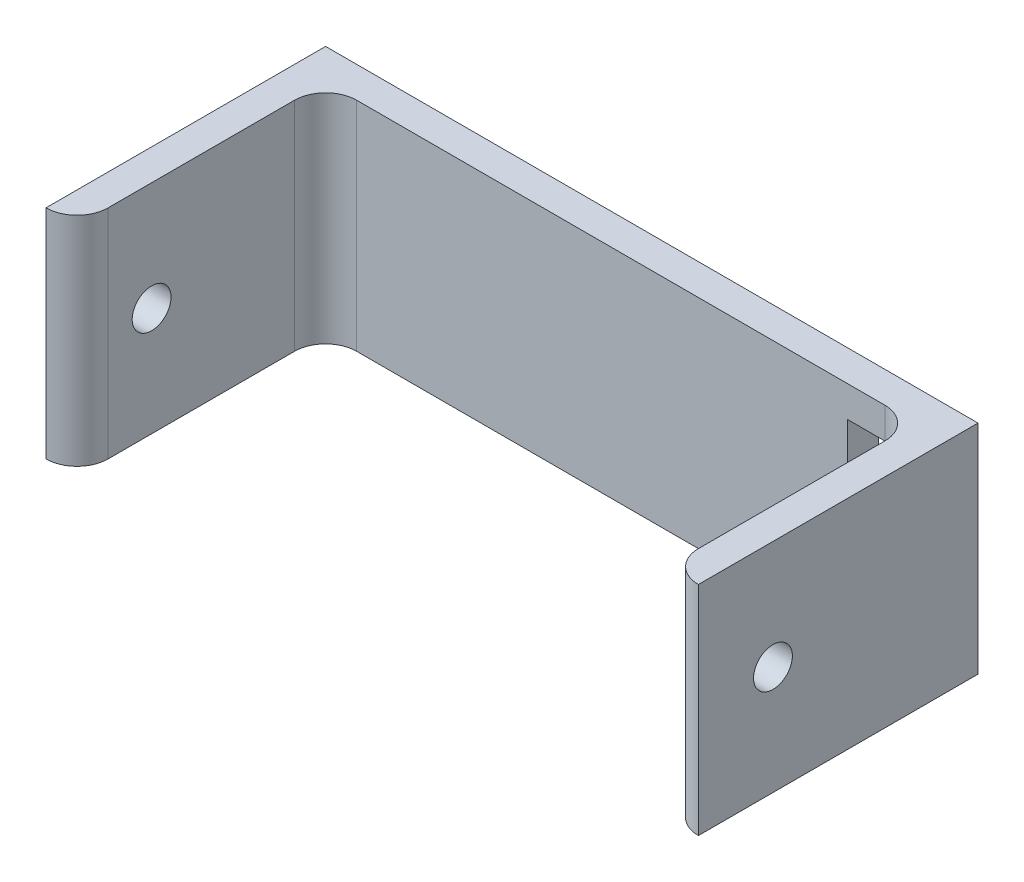
ISO-10303-21;
HEADER;
FILE_DESCRIPTION(('STEP AP214'),'2;1');
FILE_NAME('part.step','',(''),(''),'','','');
FILE_SCHEMA(('AUTOMOTIVE_DESIGN { 1 0 10303 214 1 1 1 1 }'));
ENDSEC;
DATA;
#1=APPLICATION_CONTEXT('core data for automotive mechanical design processes');
#2=APPLICATION_PROTOCOL_DEFINITION('international standard','automotive_design',2000,#1);
#3=PRODUCT_CONTEXT('',#1,'mechanical');
#4=PRODUCT('Part','Part','',(#3));
#5=PRODUCT_RELATED_PRODUCT_CATEGORY('part','',(#4));
#6=PRODUCT_DEFINITION_FORMATION('','',#4);
#7=PRODUCT_DEFINITION_CONTEXT('part definition',#1,'design');
#8=PRODUCT_DEFINITION('design','',#6,#7);
#9=PRODUCT_DEFINITION_SHAPE('','',#8);
#10=(LENGTH_UNIT() NAMED_UNIT(*) SI_UNIT(.MILLI.,.METRE.));
#11=(NAMED_UNIT(*) PLANE_ANGLE_UNIT() SI_UNIT($,.RADIAN.));
#12=(NAMED_UNIT(*) SI_UNIT($,.STERADIAN.) SOLID_ANGLE_UNIT());
#13=UNCERTAINTY_MEASURE_WITH_UNIT(LENGTH_MEASURE(1.E-05),#10,'distance_accuracy_value','');
#14=(GEOMETRIC_REPRESENTATION_CONTEXT(3) GLOBAL_UNCERTAINTY_ASSIGNED_CONTEXT((#13)) GLOBAL_UNIT_ASSIGNED_CONTEXT((#10,
#11,#12)) REPRESENTATION_CONTEXT('',''));
#15=CARTESIAN_POINT('',(0.,0.,0.));
#16=DIRECTION('',(0.,0.,1.));
#17=DIRECTION('',(1.,0.,0.));
#18=AXIS2_PLACEMENT_3D('',#15,#16,#17);
#19=CARTESIAN_POINT('',(6.34999999999999,44.45,-50.8));
#20=DIRECTION('',(1.,0.,0.));
#21=DIRECTION('',(0.,0.,-1.));
#22=AXIS2_PLACEMENT_3D('',#19,#20,#21);
#23=PLANE('',#22);
#24=CARTESIAN_POINT('',(6.34999999999999,22.225,-15.24));
#25=DIRECTION('',(1.,0.,0.));
#26=DIRECTION('',(0.,0.,-1.));
#27=AXIS2_PLACEMENT_3D('',#24,#25,#26);
#28=CIRCLE('',#27,3.96874999999998);
#29=CARTESIAN_POINT('',(6.34999999999999,22.225,-19.20875));
#30=VERTEX_POINT('',#29);
#31=EDGE_CURVE('E184',#30,#30,#28,.T.);
#32=ORIENTED_EDGE('',*,*,#31,.F.);
#33=EDGE_LOOP('',(#32));
#34=FACE_BOUND('',#33,.T.);
#35=DIRECTION('',(0.,0.,1.));
#36=VECTOR('',#35,1.);
#37=CARTESIAN_POINT('',(6.34999999999999,44.45,-50.8));
#38=LINE('',#37,#36);
#39=CARTESIAN_POINT('',(6.34999999999999,44.45,-44.45));
#40=VERTEX_POINT('',#39);
#41=CARTESIAN_POINT('',(6.35,44.45,-6.35));
#42=VERTEX_POINT('',#41);
#43=EDGE_CURVE('E188',#40,#42,#38,.T.);
#44=ORIENTED_EDGE('',*,*,#43,.T.);
#45=DIRECTION('',(0.,-1.,0.));
#46=VECTOR('',#45,1.);
#47=CARTESIAN_POINT('',(6.35,44.45,-6.35));
#48=LINE('',#47,#46);
#49=CARTESIAN_POINT('',(6.35,0.,-6.35));
#50=VERTEX_POINT('',#49);
#51=EDGE_CURVE('E262',#42,#50,#48,.T.);
#52=ORIENTED_EDGE('',*,*,#51,.T.);
#53=DIRECTION('',(0.,0.,1.));
#54=VECTOR('',#53,1.);
#55=CARTESIAN_POINT('',(6.34999999999999,0.,-50.8));
#56=LINE('',#55,#54);
#57=CARTESIAN_POINT('',(6.34999999999999,0.,-44.45));
#58=VERTEX_POINT('',#57);
#59=EDGE_CURVE('E187',#58,#50,#56,.T.);
#60=ORIENTED_EDGE('',*,*,#59,.F.);
#61=DIRECTION('',(0.,-1.,0.));
#62=VECTOR('',#61,1.);
#63=CARTESIAN_POINT('',(6.34999999999999,44.45,-44.45));
#64=LINE('',#63,#62);
#65=EDGE_CURVE('E241',#58,#40,#64,.F.);
#66=ORIENTED_EDGE('',*,*,#65,.T.);
#67=EDGE_LOOP('',(#44,#52,#60,#66));
#68=FACE_BOUND('',#67,.T.);
#69=ADVANCED_FACE('F35',(#34,#68),#23,.T.);
#70=CARTESIAN_POINT('',(127.,44.45,-50.8));
#71=DIRECTION('',(0.,0.,1.));
#72=DIRECTION('',(1.,0.,0.));
#73=AXIS2_PLACEMENT_3D('',#70,#71,#72);
#74=PLANE('',#73);
#75=DIRECTION('',(-1.,0.,0.));
#76=VECTOR('',#75,1.);
#77=CARTESIAN_POINT('',(127.,38.1,-50.8));
#78=LINE('',#77,#76);
#79=CARTESIAN_POINT('',(120.65,38.1,-50.8));
#80=VERTEX_POINT('',#79);
#81=CARTESIAN_POINT('',(113.03,38.1,-50.8));
#82=VERTEX_POINT('',#81);
#83=EDGE_CURVE('E174',#80,#82,#78,.T.);
#84=ORIENTED_EDGE('',*,*,#83,.F.);
#85=DIRECTION('',(0.,-1.,0.));
#86=VECTOR('',#85,1.);
#87=CARTESIAN_POINT('',(120.65,44.45,-50.8));
#88=LINE('',#87,#86);
#89=CARTESIAN_POINT('',(120.65,44.45,-50.8));
#90=VERTEX_POINT('',#89);
#91=EDGE_CURVE('E237',#80,#90,#88,.F.);
#92=ORIENTED_EDGE('',*,*,#91,.T.);
#93=DIRECTION('',(-1.,0.,0.));
#94=VECTOR('',#93,1.);
#95=CARTESIAN_POINT('',(127.,44.45,-50.8));
#96=LINE('',#95,#94);
#97=CARTESIAN_POINT('',(12.7,44.45,-50.8));
#98=VERTEX_POINT('',#97);
#99=EDGE_CURVE('E203',#90,#98,#96,.T.);
#100=ORIENTED_EDGE('',*,*,#99,.T.);
#101=DIRECTION('',(0.,-1.,0.));
#102=VECTOR('',#101,1.);
#103=CARTESIAN_POINT('',(12.7,0.,-50.8));
#104=LINE('',#103,#102);
#105=CARTESIAN_POINT('',(12.7,0.,-50.8));
#106=VERTEX_POINT('',#105);
#107=EDGE_CURVE('E234',#98,#106,#104,.T.);
#108=ORIENTED_EDGE('',*,*,#107,.T.);
#109=DIRECTION('',(-1.,0.,0.));
#110=VECTOR('',#109,1.);
#111=CARTESIAN_POINT('',(127.,0.,-50.8));
#112=LINE('',#111,#110);
#113=CARTESIAN_POINT('',(120.65,0.,-50.8));
#114=VERTEX_POINT('',#113);
#115=EDGE_CURVE('E192',#114,#106,#112,.T.);
#116=ORIENTED_EDGE('',*,*,#115,.F.);
#117=CARTESIAN_POINT('',(120.65,6.34999999999999,-50.8));
#118=VERTEX_POINT('',#117);
#119=EDGE_CURVE('E238',#114,#118,#88,.F.);
#120=ORIENTED_EDGE('',*,*,#119,.T.);
#121=DIRECTION('',(1.,0.,0.));
#122=VECTOR('',#121,1.);
#123=CARTESIAN_POINT('',(127.,6.34999999999999,-50.8));
#124=LINE('',#123,#122);
#125=CARTESIAN_POINT('',(113.03,6.34999999999999,-50.8));
#126=VERTEX_POINT('',#125);
#127=EDGE_CURVE('E58',#126,#118,#124,.T.);
#128=ORIENTED_EDGE('',*,*,#127,.F.);
#129=DIRECTION('',(0.,-1.,0.));
#130=VECTOR('',#129,1.);
#131=CARTESIAN_POINT('',(113.03,44.45,-50.8));
#132=LINE('',#131,#130);
#133=EDGE_CURVE('E151',#82,#126,#132,.T.);
#134=ORIENTED_EDGE('',*,*,#133,.F.);
#135=EDGE_LOOP('',(#84,#92,#100,#108,#116,#120,#128,#134));
#136=FACE_BOUND('',#135,.T.);
#137=ADVANCED_FACE('F278',(#136),#74,.T.);
#138=CARTESIAN_POINT('',(127.,44.45,0.));
#139=DIRECTION('',(-1.,0.,0.));
#140=DIRECTION('',(0.,0.,1.));
#141=AXIS2_PLACEMENT_3D('',#138,#139,#140);
#142=PLANE('',#141);
#143=CARTESIAN_POINT('',(127.,22.225,-15.24));
#144=DIRECTION('',(-1.,0.,0.));
#145=DIRECTION('',(0.,0.,1.));
#146=AXIS2_PLACEMENT_3D('',#143,#144,#145);
#147=CIRCLE('',#146,3.96874999999998);
#148=CARTESIAN_POINT('',(127.,22.225,-11.27125));
#149=VERTEX_POINT('',#148);
#150=EDGE_CURVE('E181',#149,#149,#147,.T.);
#151=ORIENTED_EDGE('',*,*,#150,.F.);
#152=EDGE_LOOP('',(#151));
#153=FACE_BOUND('',#152,.T.);
#154=DIRECTION('',(0.,0.,-1.));
#155=VECTOR('',#154,1.);
#156=CARTESIAN_POINT('',(127.,0.,0.));
#157=LINE('',#156,#155);
#158=CARTESIAN_POINT('',(127.,0.,-6.35));
#159=VERTEX_POINT('',#158);
#160=CARTESIAN_POINT('',(127.,0.,-44.45));
#161=VERTEX_POINT('',#160);
#162=EDGE_CURVE('E218',#159,#161,#157,.T.);
#163=ORIENTED_EDGE('',*,*,#162,.F.);
#164=DIRECTION('',(0.,-1.,0.));
#165=VECTOR('',#164,1.);
#166=CARTESIAN_POINT('',(127.,44.45,-6.35));
#167=LINE('',#166,#165);
#168=CARTESIAN_POINT('',(127.,44.45,-6.35));
#169=VERTEX_POINT('',#168);
#170=EDGE_CURVE('E256',#159,#169,#167,.F.);
#171=ORIENTED_EDGE('',*,*,#170,.T.);
#172=DIRECTION('',(0.,0.,-1.));
#173=VECTOR('',#172,1.);
#174=CARTESIAN_POINT('',(127.,44.45,0.));
#175=LINE('',#174,#173);
#176=CARTESIAN_POINT('',(127.,44.45,-44.45));
#177=VERTEX_POINT('',#176);
#178=EDGE_CURVE('E201',#169,#177,#175,.T.);
#179=ORIENTED_EDGE('',*,*,#178,.T.);
#180=DIRECTION('',(0.,-1.,0.));
#181=VECTOR('',#180,1.);
#182=CARTESIAN_POINT('',(127.,0.,-44.45));
#183=LINE('',#182,#181);
#184=EDGE_CURVE('E225',#177,#161,#183,.T.);
#185=ORIENTED_EDGE('',*,*,#184,.T.);
#186=EDGE_LOOP('',(#163,#171,#179,#185));
#187=FACE_BOUND('',#186,.T.);
#188=ADVANCED_FACE('F286',(#153,#187),#142,.T.);
#189=CARTESIAN_POINT('',(133.35,44.45,-57.15));
#190=DIRECTION('',(1.,0.,0.));
#191=DIRECTION('',(0.,0.,-1.));
#192=AXIS2_PLACEMENT_3D('',#189,#190,#191);
#193=PLANE('',#192);
#194=CARTESIAN_POINT('',(133.35,22.225,-15.24));
#195=DIRECTION('',(1.,0.,0.));
#196=DIRECTION('',(0.,0.,-1.));
#197=AXIS2_PLACEMENT_3D('',#194,#195,#196);
#198=CIRCLE('',#197,3.96874999999998);
#199=CARTESIAN_POINT('',(133.35,22.225,-19.20875));
#200=VERTEX_POINT('',#199);
#201=EDGE_CURVE('E178',#200,#200,#198,.T.);
#202=ORIENTED_EDGE('',*,*,#201,.F.);
#203=EDGE_LOOP('',(#202));
#204=FACE_BOUND('',#203,.T.);
#205=DIRECTION('',(0.,0.,1.));
#206=VECTOR('',#205,1.);
#207=CARTESIAN_POINT('',(133.35,0.,-57.15));
#208=LINE('',#207,#206);
#209=CARTESIAN_POINT('',(133.35,0.,-57.15));
#210=VERTEX_POINT('',#209);
#211=CARTESIAN_POINT('',(133.35,0.,0.));
#212=VERTEX_POINT('',#211);
#213=EDGE_CURVE('E215',#210,#212,#208,.T.);
#214=ORIENTED_EDGE('',*,*,#213,.F.);
#215=DIRECTION('',(0.,-1.,0.));
#216=VECTOR('',#215,1.);
#217=CARTESIAN_POINT('',(133.35,44.45,-57.15));
#218=LINE('',#217,#216);
#219=CARTESIAN_POINT('',(133.35,44.45,-57.15));
#220=VERTEX_POINT('',#219);
#221=EDGE_CURVE('E226',#220,#210,#218,.T.);
#222=ORIENTED_EDGE('',*,*,#221,.F.);
#223=DIRECTION('',(0.,0.,1.));
#224=VECTOR('',#223,1.);
#225=CARTESIAN_POINT('',(133.35,44.45,-57.15));
#226=LINE('',#225,#224);
#227=CARTESIAN_POINT('',(133.35,44.45,0.));
#228=VERTEX_POINT('',#227);
#229=EDGE_CURVE('E198',#220,#228,#226,.T.);
#230=ORIENTED_EDGE('',*,*,#229,.T.);
#231=DIRECTION('',(0.,-1.,0.));
#232=VECTOR('',#231,1.);
#233=CARTESIAN_POINT('',(133.35,44.45,0.));
#234=LINE('',#233,#232);
#235=EDGE_CURVE('E222',#228,#212,#234,.T.);
#236=ORIENTED_EDGE('',*,*,#235,.T.);
#237=EDGE_LOOP('',(#214,#222,#230,#236));
#238=FACE_BOUND('',#237,.T.);
#239=ADVANCED_FACE('F313',(#204,#238),#193,.T.);
#240=CARTESIAN_POINT('',(0.,44.45,-57.15));
#241=DIRECTION('',(0.,0.,-1.));
#242=DIRECTION('',(-1.,0.,0.));
#243=AXIS2_PLACEMENT_3D('',#240,#241,#242);
#244=PLANE('',#243);
#245=DIRECTION('',(0.,-1.,0.));
#246=VECTOR('',#245,1.);
#247=CARTESIAN_POINT('',(113.03,38.1,-57.15));
#248=LINE('',#247,#246);
#249=CARTESIAN_POINT('',(113.03,38.1,-57.15));
#250=VERTEX_POINT('',#249);
#251=CARTESIAN_POINT('',(113.03,6.34999999999999,-57.15));
#252=VERTEX_POINT('',#251);
#253=EDGE_CURVE('E148',#250,#252,#248,.T.);
#254=ORIENTED_EDGE('',*,*,#253,.T.);
#255=DIRECTION('',(1.,0.,0.));
#256=VECTOR('',#255,1.);
#257=CARTESIAN_POINT('',(113.03,6.34999999999999,-57.15));
#258=LINE('',#257,#256);
#259=CARTESIAN_POINT('',(124.46,6.34999999999999,-57.15));
#260=VERTEX_POINT('',#259);
#261=EDGE_CURVE('E156',#252,#260,#258,.T.);
#262=ORIENTED_EDGE('',*,*,#261,.T.);
#263=DIRECTION('',(0.,1.,0.));
#264=VECTOR('',#263,1.);
#265=CARTESIAN_POINT('',(124.46,38.1,-57.15));
#266=LINE('',#265,#264);
#267=CARTESIAN_POINT('',(124.46,38.1,-57.15));
#268=VERTEX_POINT('',#267);
#269=EDGE_CURVE('E50',#260,#268,#266,.T.);
#270=ORIENTED_EDGE('',*,*,#269,.T.);
#271=DIRECTION('',(-1.,0.,0.));
#272=VECTOR('',#271,1.);
#273=CARTESIAN_POINT('',(113.03,38.1,-57.15));
#274=LINE('',#273,#272);
#275=EDGE_CURVE('E153',#268,#250,#274,.T.);
#276=ORIENTED_EDGE('',*,*,#275,.T.);
#277=EDGE_LOOP('',(#254,#262,#270,#276));
#278=FACE_BOUND('',#277,.T.);
#279=DIRECTION('',(1.,0.,0.));
#280=VECTOR('',#279,1.);
#281=CARTESIAN_POINT('',(0.,0.,-57.15));
#282=LINE('',#281,#280);
#283=CARTESIAN_POINT('',(0.,0.,-57.15));
#284=VERTEX_POINT('',#283);
#285=EDGE_CURVE('E212',#284,#210,#282,.T.);
#286=ORIENTED_EDGE('',*,*,#285,.F.);
#287=DIRECTION('',(0.,-1.,0.));
#288=VECTOR('',#287,1.);
#289=CARTESIAN_POINT('',(0.,44.45,-57.15));
#290=LINE('',#289,#288);
#291=CARTESIAN_POINT('',(0.,44.45,-57.15));
#292=VERTEX_POINT('',#291);
#293=EDGE_CURVE('E228',#292,#284,#290,.T.);
#294=ORIENTED_EDGE('',*,*,#293,.F.);
#295=DIRECTION('',(1.,0.,0.));
#296=VECTOR('',#295,1.);
#297=CARTESIAN_POINT('',(0.,44.45,-57.15));
#298=LINE('',#297,#296);
#299=EDGE_CURVE('E195',#292,#220,#298,.T.);
#300=ORIENTED_EDGE('',*,*,#299,.T.);
#301=ORIENTED_EDGE('',*,*,#221,.T.);
#302=EDGE_LOOP('',(#286,#294,#300,#301));
#303=FACE_BOUND('',#302,.T.);
#304=ADVANCED_FACE('F160',(#278,#303),#244,.T.);
#305=CARTESIAN_POINT('',(0.,44.45,0.));
#306=DIRECTION('',(-1.,0.,0.));
#307=DIRECTION('',(0.,0.,1.));
#308=AXIS2_PLACEMENT_3D('',#305,#306,#307);
#309=PLANE('',#308);
#310=CARTESIAN_POINT('',(0.,22.225,-15.24));
#311=DIRECTION('',(-1.,0.,0.));
#312=DIRECTION('',(0.,0.,1.));
#313=AXIS2_PLACEMENT_3D('',#310,#311,#312);
#314=CIRCLE('',#313,3.96874999999998);
#315=CARTESIAN_POINT('',(0.,22.225,-11.27125));
#316=VERTEX_POINT('',#315);
#317=EDGE_CURVE('E177',#316,#316,#314,.T.);
#318=ORIENTED_EDGE('',*,*,#317,.F.);
#319=EDGE_LOOP('',(#318));
#320=FACE_BOUND('',#319,.T.);
#321=DIRECTION('',(0.,0.,-1.));
#322=VECTOR('',#321,1.);
#323=CARTESIAN_POINT('',(0.,0.,0.));
#324=LINE('',#323,#322);
#325=CARTESIAN_POINT('',(0.,0.,0.));
#326=VERTEX_POINT('',#325);
#327=EDGE_CURVE('E209',#326,#284,#324,.T.);
#328=ORIENTED_EDGE('',*,*,#327,.F.);
#329=DIRECTION('',(0.,-1.,0.));
#330=VECTOR('',#329,1.);
#331=CARTESIAN_POINT('',(0.,44.45,0.));
#332=LINE('',#331,#330);
#333=CARTESIAN_POINT('',(0.,44.45,0.));
#334=VERTEX_POINT('',#333);
#335=EDGE_CURVE('E206',#334,#326,#332,.T.);
#336=ORIENTED_EDGE('',*,*,#335,.F.);
#337=DIRECTION('',(0.,0.,-1.));
#338=VECTOR('',#337,1.);
#339=CARTESIAN_POINT('',(0.,44.45,0.));
#340=LINE('',#339,#338);
#341=EDGE_CURVE('E191',#334,#292,#340,.T.);
#342=ORIENTED_EDGE('',*,*,#341,.T.);
#343=ORIENTED_EDGE('',*,*,#293,.T.);
#344=EDGE_LOOP('',(#328,#336,#342,#343));
#345=FACE_BOUND('',#344,.T.);
#346=ADVANCED_FACE('F307',(#320,#345),#309,.T.);
#347=CARTESIAN_POINT('',(0.,44.45,0.));
#348=DIRECTION('',(0.,-1.,0.));
#349=DIRECTION('',(0.,0.,-1.));
#350=AXIS2_PLACEMENT_3D('',#347,#348,#349);
#351=PLANE('',#350);
#352=ORIENTED_EDGE('',*,*,#178,.F.);
#353=CARTESIAN_POINT('',(133.35,44.45,-6.35));
#354=DIRECTION('',(0.,-1.,0.));
#355=DIRECTION('',(0.,0.,-1.));
#356=AXIS2_PLACEMENT_3D('',#353,#354,#355);
#357=CIRCLE('',#356,6.35);
#358=EDGE_CURVE('E260',#169,#228,#357,.F.);
#359=ORIENTED_EDGE('',*,*,#358,.T.);
#360=ORIENTED_EDGE('',*,*,#229,.F.);
#361=ORIENTED_EDGE('',*,*,#299,.F.);
#362=ORIENTED_EDGE('',*,*,#341,.F.);
#363=CARTESIAN_POINT('',(0.,44.45,-6.35));
#364=DIRECTION('',(0.,-1.,0.));
#365=DIRECTION('',(0.,0.,-1.));
#366=AXIS2_PLACEMENT_3D('',#363,#364,#365);
#367=CIRCLE('',#366,6.35);
#368=EDGE_CURVE('E258',#334,#42,#367,.F.);
#369=ORIENTED_EDGE('',*,*,#368,.T.);
#370=ORIENTED_EDGE('',*,*,#43,.F.);
#371=CARTESIAN_POINT('',(12.7,44.45,-44.45));
#372=DIRECTION('',(0.,-1.,0.));
#373=DIRECTION('',(0.,0.,-1.));
#374=AXIS2_PLACEMENT_3D('',#371,#372,#373);
#375=CIRCLE('',#374,6.35);
#376=EDGE_CURVE('E250',#40,#98,#375,.T.);
#377=ORIENTED_EDGE('',*,*,#376,.T.);
#378=ORIENTED_EDGE('',*,*,#99,.F.);
#379=CARTESIAN_POINT('',(120.65,44.45,-44.45));
#380=DIRECTION('',(0.,-1.,0.));
#381=DIRECTION('',(0.,0.,-1.));
#382=AXIS2_PLACEMENT_3D('',#379,#380,#381);
#383=CIRCLE('',#382,6.35);
#384=EDGE_CURVE('E245',#90,#177,#383,.T.);
#385=ORIENTED_EDGE('',*,*,#384,.T.);
#386=EDGE_LOOP('',(#352,#359,#360,#361,#362,#369,#370,#377,#378,#385));
#387=FACE_BOUND('',#386,.T.);
#388=ADVANCED_FACE('F292',(#387),#351,.F.);
#389=CARTESIAN_POINT('',(0.,0.,0.));
#390=DIRECTION('',(0.,-1.,0.));
#391=DIRECTION('',(0.,0.,-1.));
#392=AXIS2_PLACEMENT_3D('',#389,#390,#391);
#393=PLANE('',#392);
#394=ORIENTED_EDGE('',*,*,#213,.T.);
#395=CARTESIAN_POINT('',(133.35,0.,-6.35));
#396=DIRECTION('',(0.,-1.,0.));
#397=DIRECTION('',(0.,0.,-1.));
#398=AXIS2_PLACEMENT_3D('',#395,#396,#397);
#399=CIRCLE('',#398,6.35);
#400=EDGE_CURVE('E254',#212,#159,#399,.T.);
#401=ORIENTED_EDGE('',*,*,#400,.T.);
#402=ORIENTED_EDGE('',*,*,#162,.T.);
#403=CARTESIAN_POINT('',(120.65,0.,-44.45));
#404=DIRECTION('',(0.,-1.,0.));
#405=DIRECTION('',(0.,0.,-1.));
#406=AXIS2_PLACEMENT_3D('',#403,#404,#405);
#407=CIRCLE('',#406,6.35);
#408=EDGE_CURVE('E243',#161,#114,#407,.F.);
#409=ORIENTED_EDGE('',*,*,#408,.T.);
#410=ORIENTED_EDGE('',*,*,#115,.T.);
#411=CARTESIAN_POINT('',(12.7,0.,-44.45));
#412=DIRECTION('',(0.,-1.,0.));
#413=DIRECTION('',(0.,0.,-1.));
#414=AXIS2_PLACEMENT_3D('',#411,#412,#413);
#415=CIRCLE('',#414,6.35);
#416=EDGE_CURVE('E248',#106,#58,#415,.F.);
#417=ORIENTED_EDGE('',*,*,#416,.T.);
#418=ORIENTED_EDGE('',*,*,#59,.T.);
#419=CARTESIAN_POINT('',(0.,0.,-6.35));
#420=DIRECTION('',(0.,-1.,0.));
#421=DIRECTION('',(0.,0.,-1.));
#422=AXIS2_PLACEMENT_3D('',#419,#420,#421);
#423=CIRCLE('',#422,6.35);
#424=EDGE_CURVE('E252',#50,#326,#423,.T.);
#425=ORIENTED_EDGE('',*,*,#424,.T.);
#426=ORIENTED_EDGE('',*,*,#327,.T.);
#427=ORIENTED_EDGE('',*,*,#285,.T.);
#428=EDGE_LOOP('',(#394,#401,#402,#409,#410,#417,#418,#425,#426,#427));
#429=FACE_BOUND('',#428,.T.);
#430=ADVANCED_FACE('F299',(#429),#393,.T.);
#431=CARTESIAN_POINT('',(120.65,44.45,-44.45));
#432=DIRECTION('',(0.,1.,0.));
#433=DIRECTION('',(0.,0.,1.));
#434=AXIS2_PLACEMENT_3D('',#431,#432,#433);
#435=CYLINDRICAL_SURFACE('',#434,6.35);
#436=ORIENTED_EDGE('',*,*,#91,.F.);
#437=CARTESIAN_POINT('',(120.65,38.1,-44.45));
#438=DIRECTION('',(0.,1.,0.));
#439=DIRECTION('',(0.,0.,1.));
#440=AXIS2_PLACEMENT_3D('',#437,#438,#439);
#441=CIRCLE('',#440,6.35);
#442=CARTESIAN_POINT('',(124.46,38.1,-49.53));
#443=VERTEX_POINT('',#442);
#444=EDGE_CURVE('E11',#80,#443,#441,.F.);
#445=ORIENTED_EDGE('',*,*,#444,.T.);
#446=DIRECTION('',(0.,1.,0.));
#447=VECTOR('',#446,1.);
#448=CARTESIAN_POINT('',(124.46,44.45,-49.53));
#449=LINE('',#448,#447);
#450=CARTESIAN_POINT('',(124.46,6.34999999999999,-49.53));
#451=VERTEX_POINT('',#450);
#452=EDGE_CURVE('E43',#443,#451,#449,.F.);
#453=ORIENTED_EDGE('',*,*,#452,.T.);
#454=CARTESIAN_POINT('',(120.65,6.34999999999999,-44.45));
#455=DIRECTION('',(0.,-1.,0.));
#456=DIRECTION('',(0.,0.,-1.));
#457=AXIS2_PLACEMENT_3D('',#454,#455,#456);
#458=CIRCLE('',#457,6.35);
#459=EDGE_CURVE('E265',#451,#118,#458,.F.);
#460=ORIENTED_EDGE('',*,*,#459,.T.);
#461=ORIENTED_EDGE('',*,*,#119,.F.);
#462=ORIENTED_EDGE('',*,*,#408,.F.);
#463=ORIENTED_EDGE('',*,*,#184,.F.);
#464=ORIENTED_EDGE('',*,*,#384,.F.);
#465=EDGE_LOOP('',(#436,#445,#453,#460,#461,#462,#463,#464));
#466=FACE_BOUND('',#465,.T.);
#467=ADVANCED_FACE('F271',(#466),#435,.F.);
#468=CARTESIAN_POINT('',(12.7,44.45,-44.45));
#469=DIRECTION('',(0.,1.,0.));
#470=DIRECTION('',(0.,0.,1.));
#471=AXIS2_PLACEMENT_3D('',#468,#469,#470);
#472=CYLINDRICAL_SURFACE('',#471,6.35);
#473=ORIENTED_EDGE('',*,*,#376,.F.);
#474=ORIENTED_EDGE('',*,*,#65,.F.);
#475=ORIENTED_EDGE('',*,*,#416,.F.);
#476=ORIENTED_EDGE('',*,*,#107,.F.);
#477=EDGE_LOOP('',(#473,#474,#475,#476));
#478=FACE_BOUND('',#477,.T.);
#479=ADVANCED_FACE('F296',(#478),#472,.F.);
#480=CARTESIAN_POINT('',(133.35,44.45,-6.35));
#481=DIRECTION('',(0.,-1.,0.));
#482=DIRECTION('',(0.,0.,-1.));
#483=AXIS2_PLACEMENT_3D('',#480,#481,#482);
#484=CYLINDRICAL_SURFACE('',#483,6.35);
#485=ORIENTED_EDGE('',*,*,#358,.F.);
#486=ORIENTED_EDGE('',*,*,#170,.F.);
#487=ORIENTED_EDGE('',*,*,#400,.F.);
#488=ORIENTED_EDGE('',*,*,#235,.F.);
#489=EDGE_LOOP('',(#485,#486,#487,#488));
#490=FACE_BOUND('',#489,.T.);
#491=ADVANCED_FACE('F317',(#490),#484,.T.);
#492=CARTESIAN_POINT('',(0.,44.45,-6.35));
#493=DIRECTION('',(0.,-1.,0.));
#494=DIRECTION('',(0.,0.,-1.));
#495=AXIS2_PLACEMENT_3D('',#492,#493,#494);
#496=CYLINDRICAL_SURFACE('',#495,6.35);
#497=ORIENTED_EDGE('',*,*,#368,.F.);
#498=ORIENTED_EDGE('',*,*,#335,.T.);
#499=ORIENTED_EDGE('',*,*,#424,.F.);
#500=ORIENTED_EDGE('',*,*,#51,.F.);
#501=EDGE_LOOP('',(#497,#498,#499,#500));
#502=FACE_BOUND('',#501,.T.);
#503=ADVANCED_FACE('F37',(#502),#496,.T.);
#504=CARTESIAN_POINT('',(-114.3,22.225,-15.24));
#505=DIRECTION('',(1.,0.,0.));
#506=DIRECTION('',(0.,1.,0.));
#507=AXIS2_PLACEMENT_3D('',#504,#505,#506);
#508=CYLINDRICAL_SURFACE('',#507,3.96874999999998);
#509=ORIENTED_EDGE('',*,*,#31,.T.);
#510=EDGE_LOOP('',(#509));
#511=FACE_BOUND('',#510,.T.);
#512=ORIENTED_EDGE('',*,*,#317,.T.);
#513=EDGE_LOOP('',(#512));
#514=FACE_BOUND('',#513,.T.);
#515=ADVANCED_FACE('F323',(#511,#514),#508,.F.);
#516=ORIENTED_EDGE('',*,*,#150,.T.);
#517=EDGE_LOOP('',(#516));
#518=FACE_BOUND('',#517,.T.);
#519=ORIENTED_EDGE('',*,*,#201,.T.);
#520=EDGE_LOOP('',(#519));
#521=FACE_BOUND('',#520,.T.);
#522=ADVANCED_FACE('F362',(#518,#521),#508,.F.);
#523=CARTESIAN_POINT('',(124.46,38.1,-57.15));
#524=DIRECTION('',(1.,0.,0.));
#525=DIRECTION('',(0.,0.,-1.));
#526=AXIS2_PLACEMENT_3D('',#523,#524,#525);
#527=PLANE('',#526);
#528=DIRECTION('',(0.,0.,1.));
#529=VECTOR('',#528,1.);
#530=CARTESIAN_POINT('',(124.46,38.1,-57.15));
#531=LINE('',#530,#529);
#532=EDGE_CURVE('E169',#268,#443,#531,.T.);
#533=ORIENTED_EDGE('',*,*,#532,.F.);
#534=ORIENTED_EDGE('',*,*,#269,.F.);
#535=DIRECTION('',(0.,0.,1.));
#536=VECTOR('',#535,1.);
#537=CARTESIAN_POINT('',(124.46,6.34999999999999,-57.15));
#538=LINE('',#537,#536);
#539=EDGE_CURVE('E152',#260,#451,#538,.T.);
#540=ORIENTED_EDGE('',*,*,#539,.T.);
#541=ORIENTED_EDGE('',*,*,#452,.F.);
#542=EDGE_LOOP('',(#533,#534,#540,#541));
#543=FACE_BOUND('',#542,.T.);
#544=ADVANCED_FACE('F273',(#543),#527,.F.);
#545=CARTESIAN_POINT('',(113.03,38.1,-57.15));
#546=DIRECTION('',(-1.,0.,0.));
#547=DIRECTION('',(0.,0.,1.));
#548=AXIS2_PLACEMENT_3D('',#545,#546,#547);
#549=PLANE('',#548);
#550=ORIENTED_EDGE('',*,*,#133,.T.);
#551=DIRECTION('',(0.,0.,1.));
#552=VECTOR('',#551,1.);
#553=CARTESIAN_POINT('',(113.03,6.34999999999999,-57.15));
#554=LINE('',#553,#552);
#555=EDGE_CURVE('E143',#252,#126,#554,.T.);
#556=ORIENTED_EDGE('',*,*,#555,.F.);
#557=ORIENTED_EDGE('',*,*,#253,.F.);
#558=DIRECTION('',(0.,0.,1.));
#559=VECTOR('',#558,1.);
#560=CARTESIAN_POINT('',(113.03,38.1,-57.15));
#561=LINE('',#560,#559);
#562=EDGE_CURVE('E167',#250,#82,#561,.T.);
#563=ORIENTED_EDGE('',*,*,#562,.T.);
#564=EDGE_LOOP('',(#550,#556,#557,#563));
#565=FACE_BOUND('',#564,.T.);
#566=ADVANCED_FACE('F145',(#565),#549,.F.);
#567=CARTESIAN_POINT('',(113.03,38.1,-57.15));
#568=DIRECTION('',(0.,1.,0.));
#569=DIRECTION('',(0.,0.,1.));
#570=AXIS2_PLACEMENT_3D('',#567,#568,#569);
#571=PLANE('',#570);
#572=ORIENTED_EDGE('',*,*,#83,.T.);
#573=ORIENTED_EDGE('',*,*,#562,.F.);
#574=ORIENTED_EDGE('',*,*,#275,.F.);
#575=ORIENTED_EDGE('',*,*,#532,.T.);
#576=ORIENTED_EDGE('',*,*,#444,.F.);
#577=EDGE_LOOP('',(#572,#573,#574,#575,#576));
#578=FACE_BOUND('',#577,.T.);
#579=ADVANCED_FACE('F275',(#578),#571,.F.);
#580=CARTESIAN_POINT('',(113.03,6.34999999999999,-57.15));
#581=DIRECTION('',(0.,-1.,0.));
#582=DIRECTION('',(0.,0.,-1.));
#583=AXIS2_PLACEMENT_3D('',#580,#581,#582);
#584=PLANE('',#583);
#585=ORIENTED_EDGE('',*,*,#127,.T.);
#586=ORIENTED_EDGE('',*,*,#459,.F.);
#587=ORIENTED_EDGE('',*,*,#539,.F.);
#588=ORIENTED_EDGE('',*,*,#261,.F.);
#589=ORIENTED_EDGE('',*,*,#555,.T.);
#590=EDGE_LOOP('',(#585,#586,#587,#588,#589));
#591=FACE_BOUND('',#590,.T.);
#592=ADVANCED_FACE('F157',(#591),#584,.F.);
#593=CLOSED_SHELL('',(#69,#137,#188,#239,#304,#346,#388,#430,#467,#479,#491,#503,#515,#522,#544,
#566,#579,#592));
#594=MANIFOLD_SOLID_BREP('B2',#593);
#595=ADVANCED_BREP_SHAPE_REPRESENTATION('',(#18,#594),#14);
#596=SHAPE_DEFINITION_REPRESENTATION(#9,#595);
ENDSEC;
END-ISO-10303-21;
